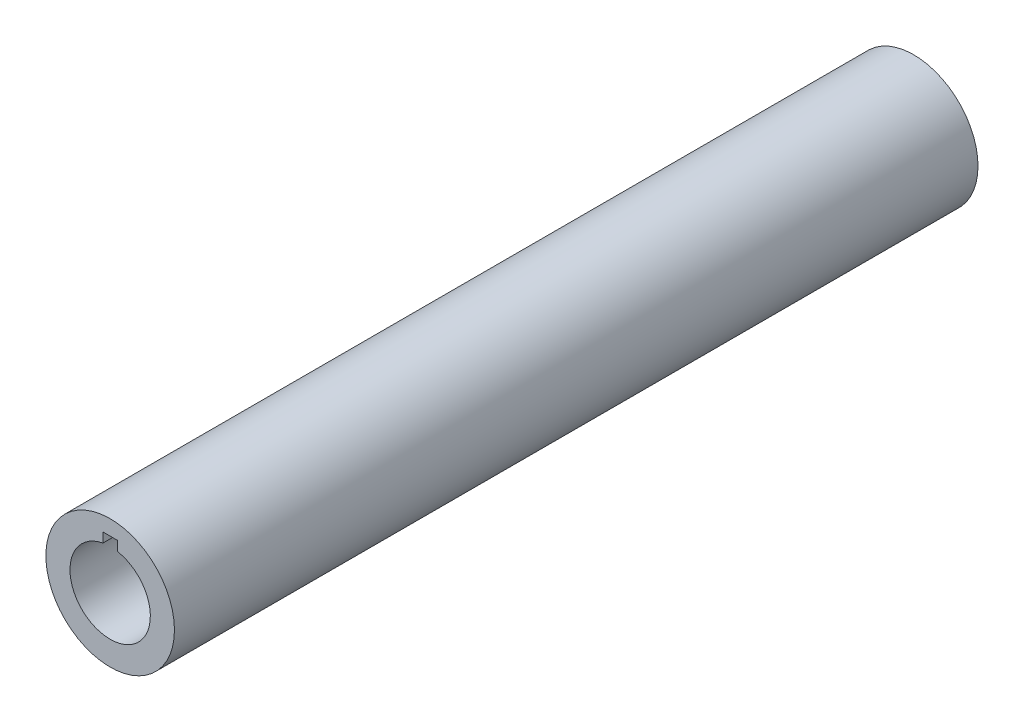
ISO-10303-21;
HEADER;
FILE_DESCRIPTION(('STEP AP214'),'2;1');
FILE_NAME('part.step','',(''),(''),'','','');
FILE_SCHEMA(('AUTOMOTIVE_DESIGN { 1 0 10303 214 1 1 1 1 }'));
ENDSEC;
DATA;
#1=APPLICATION_CONTEXT('core data for automotive mechanical design processes');
#2=APPLICATION_PROTOCOL_DEFINITION('international standard','automotive_design',2000,#1);
#3=PRODUCT_CONTEXT('',#1,'mechanical');
#4=PRODUCT('Part','Part','',(#3));
#5=PRODUCT_RELATED_PRODUCT_CATEGORY('part','',(#4));
#6=PRODUCT_DEFINITION_FORMATION('','',#4);
#7=PRODUCT_DEFINITION_CONTEXT('part definition',#1,'design');
#8=PRODUCT_DEFINITION('design','',#6,#7);
#9=PRODUCT_DEFINITION_SHAPE('','',#8);
#10=(LENGTH_UNIT() NAMED_UNIT(*) SI_UNIT(.MILLI.,.METRE.));
#11=(NAMED_UNIT(*) PLANE_ANGLE_UNIT() SI_UNIT($,.RADIAN.));
#12=(NAMED_UNIT(*) SI_UNIT($,.STERADIAN.) SOLID_ANGLE_UNIT());
#13=UNCERTAINTY_MEASURE_WITH_UNIT(LENGTH_MEASURE(1.E-05),#10,'distance_accuracy_value','');
#14=(GEOMETRIC_REPRESENTATION_CONTEXT(3) GLOBAL_UNCERTAINTY_ASSIGNED_CONTEXT((#13)) GLOBAL_UNIT_ASSIGNED_CONTEXT((#10,
#11,#12)) REPRESENTATION_CONTEXT('',''));
#15=CARTESIAN_POINT('',(0.,0.,0.));
#16=DIRECTION('',(0.,0.,1.));
#17=DIRECTION('',(1.,0.,0.));
#18=AXIS2_PLACEMENT_3D('',#15,#16,#17);
#19=CARTESIAN_POINT('',(0.,0.,50.));
#20=DIRECTION('',(0.,0.,1.));
#21=DIRECTION('',(1.,0.,0.));
#22=AXIS2_PLACEMENT_3D('',#19,#20,#21);
#23=PLANE('',#22);
#24=CARTESIAN_POINT('',(0.,0.,50.));
#25=DIRECTION('',(0.,0.,1.));
#26=DIRECTION('',(1.,0.,0.));
#27=AXIS2_PLACEMENT_3D('',#24,#25,#26);
#28=CIRCLE('',#27,4.);
#29=CARTESIAN_POINT('',(4.,0.,50.));
#30=VERTEX_POINT('',#29);
#31=EDGE_CURVE('E11',#30,#30,#28,.T.);
#32=ORIENTED_EDGE('',*,*,#31,.T.);
#33=EDGE_LOOP('',(#32));
#34=FACE_BOUND('',#33,.T.);
#35=DIRECTION('',(0.,1.,0.));
#36=VECTOR('',#35,1.);
#37=CARTESIAN_POINT('',(0.45,2.45916652547159,50.));
#38=LINE('',#37,#36);
#39=CARTESIAN_POINT('',(0.45,2.45916652547159,50.));
#40=VERTEX_POINT('',#39);
#41=CARTESIAN_POINT('',(0.45,3.05916652547159,50.));
#42=VERTEX_POINT('',#41);
#43=EDGE_CURVE('E90',#40,#42,#38,.T.);
#44=ORIENTED_EDGE('',*,*,#43,.F.);
#45=CARTESIAN_POINT('',(0.,0.,50.));
#46=DIRECTION('',(0.,0.,1.));
#47=DIRECTION('',(1.,0.,0.));
#48=AXIS2_PLACEMENT_3D('',#45,#46,#47);
#49=CIRCLE('',#48,2.5);
#50=CARTESIAN_POINT('',(-0.45,2.45916652547159,50.));
#51=VERTEX_POINT('',#50);
#52=EDGE_CURVE('E82',#51,#40,#49,.T.);
#53=ORIENTED_EDGE('',*,*,#52,.F.);
#54=DIRECTION('',(0.,-1.,0.));
#55=VECTOR('',#54,1.);
#56=CARTESIAN_POINT('',(-0.45,2.45916652547159,50.));
#57=LINE('',#56,#55);
#58=CARTESIAN_POINT('',(-0.45,3.05916652547159,50.));
#59=VERTEX_POINT('',#58);
#60=EDGE_CURVE('E103',#59,#51,#57,.T.);
#61=ORIENTED_EDGE('',*,*,#60,.F.);
#62=DIRECTION('',(-1.,0.,0.));
#63=VECTOR('',#62,1.);
#64=CARTESIAN_POINT('',(-0.45,3.05916652547159,50.));
#65=LINE('',#64,#63);
#66=EDGE_CURVE('E101',#42,#59,#65,.T.);
#67=ORIENTED_EDGE('',*,*,#66,.F.);
#68=EDGE_LOOP('',(#44,#53,#61,#67));
#69=FACE_BOUND('',#68,.T.);
#70=ADVANCED_FACE('F41',(#34,#69),#23,.T.);
#71=CARTESIAN_POINT('',(0.,0.,0.));
#72=DIRECTION('',(0.,0.,1.));
#73=DIRECTION('',(1.,0.,0.));
#74=AXIS2_PLACEMENT_3D('',#71,#72,#73);
#75=PLANE('',#74);
#76=CARTESIAN_POINT('',(0.,0.,0.));
#77=DIRECTION('',(0.,0.,1.));
#78=DIRECTION('',(1.,0.,0.));
#79=AXIS2_PLACEMENT_3D('',#76,#77,#78);
#80=CIRCLE('',#79,4.);
#81=CARTESIAN_POINT('',(4.,0.,0.));
#82=VERTEX_POINT('',#81);
#83=EDGE_CURVE('E45',#82,#82,#80,.T.);
#84=ORIENTED_EDGE('',*,*,#83,.F.);
#85=EDGE_LOOP('',(#84));
#86=FACE_BOUND('',#85,.T.);
#87=CARTESIAN_POINT('',(0.,0.,0.));
#88=DIRECTION('',(0.,0.,1.));
#89=DIRECTION('',(1.,0.,0.));
#90=AXIS2_PLACEMENT_3D('',#87,#88,#89);
#91=CIRCLE('',#90,2.5);
#92=CARTESIAN_POINT('',(-0.45,2.45916652547159,0.));
#93=VERTEX_POINT('',#92);
#94=CARTESIAN_POINT('',(0.45,2.45916652547159,0.));
#95=VERTEX_POINT('',#94);
#96=EDGE_CURVE('E64',#93,#95,#91,.T.);
#97=ORIENTED_EDGE('',*,*,#96,.T.);
#98=DIRECTION('',(0.,1.,0.));
#99=VECTOR('',#98,1.);
#100=CARTESIAN_POINT('',(0.45,2.45916652547159,0.));
#101=LINE('',#100,#99);
#102=CARTESIAN_POINT('',(0.45,3.05916652547159,0.));
#103=VERTEX_POINT('',#102);
#104=EDGE_CURVE('E97',#95,#103,#101,.T.);
#105=ORIENTED_EDGE('',*,*,#104,.T.);
#106=DIRECTION('',(-1.,0.,0.));
#107=VECTOR('',#106,1.);
#108=CARTESIAN_POINT('',(-0.45,3.05916652547159,0.));
#109=LINE('',#108,#107);
#110=CARTESIAN_POINT('',(-0.45,3.05916652547159,0.));
#111=VERTEX_POINT('',#110);
#112=EDGE_CURVE('E109',#103,#111,#109,.T.);
#113=ORIENTED_EDGE('',*,*,#112,.T.);
#114=DIRECTION('',(0.,-1.,0.));
#115=VECTOR('',#114,1.);
#116=CARTESIAN_POINT('',(-0.45,2.45916652547159,0.));
#117=LINE('',#116,#115);
#118=EDGE_CURVE('E91',#111,#93,#117,.T.);
#119=ORIENTED_EDGE('',*,*,#118,.T.);
#120=EDGE_LOOP('',(#97,#105,#113,#119));
#121=FACE_BOUND('',#120,.T.);
#122=ADVANCED_FACE('F120',(#86,#121),#75,.F.);
#123=CARTESIAN_POINT('',(0.,0.,50.));
#124=DIRECTION('',(0.,0.,-1.));
#125=DIRECTION('',(-1.,0.,0.));
#126=AXIS2_PLACEMENT_3D('',#123,#124,#125);
#127=CYLINDRICAL_SURFACE('',#126,4.);
#128=ORIENTED_EDGE('',*,*,#31,.F.);
#129=EDGE_LOOP('',(#128));
#130=FACE_BOUND('',#129,.T.);
#131=ORIENTED_EDGE('',*,*,#83,.T.);
#132=EDGE_LOOP('',(#131));
#133=FACE_BOUND('',#132,.T.);
#134=ADVANCED_FACE('F43',(#130,#133),#127,.T.);
#135=CARTESIAN_POINT('',(0.,0.,50.));
#136=DIRECTION('',(0.,0.,-1.));
#137=DIRECTION('',(-1.,0.,0.));
#138=AXIS2_PLACEMENT_3D('',#135,#136,#137);
#139=CYLINDRICAL_SURFACE('',#138,2.5);
#140=ORIENTED_EDGE('',*,*,#96,.F.);
#141=DIRECTION('',(0.,0.,-1.));
#142=VECTOR('',#141,1.);
#143=CARTESIAN_POINT('',(-0.45,2.45916652547159,50.));
#144=LINE('',#143,#142);
#145=EDGE_CURVE('E86',#51,#93,#144,.T.);
#146=ORIENTED_EDGE('',*,*,#145,.F.);
#147=ORIENTED_EDGE('',*,*,#52,.T.);
#148=DIRECTION('',(0.,0.,-1.));
#149=VECTOR('',#148,1.);
#150=CARTESIAN_POINT('',(0.45,2.45916652547159,50.));
#151=LINE('',#150,#149);
#152=EDGE_CURVE('E85',#40,#95,#151,.T.);
#153=ORIENTED_EDGE('',*,*,#152,.T.);
#154=EDGE_LOOP('',(#140,#146,#147,#153));
#155=FACE_BOUND('',#154,.T.);
#156=ADVANCED_FACE('F84',(#155),#139,.F.);
#157=CARTESIAN_POINT('',(0.45,2.45916652547159,50.));
#158=DIRECTION('',(-1.,0.,0.));
#159=DIRECTION('',(0.,0.,1.));
#160=AXIS2_PLACEMENT_3D('',#157,#158,#159);
#161=PLANE('',#160);
#162=ORIENTED_EDGE('',*,*,#104,.F.);
#163=ORIENTED_EDGE('',*,*,#152,.F.);
#164=ORIENTED_EDGE('',*,*,#43,.T.);
#165=DIRECTION('',(0.,0.,-1.));
#166=VECTOR('',#165,1.);
#167=CARTESIAN_POINT('',(0.45,3.05916652547159,50.));
#168=LINE('',#167,#166);
#169=EDGE_CURVE('E98',#42,#103,#168,.T.);
#170=ORIENTED_EDGE('',*,*,#169,.T.);
#171=EDGE_LOOP('',(#162,#163,#164,#170));
#172=FACE_BOUND('',#171,.T.);
#173=ADVANCED_FACE('F94',(#172),#161,.T.);
#174=CARTESIAN_POINT('',(-0.45,3.05916652547159,50.));
#175=DIRECTION('',(0.,-1.,0.));
#176=DIRECTION('',(0.,0.,-1.));
#177=AXIS2_PLACEMENT_3D('',#174,#175,#176);
#178=PLANE('',#177);
#179=ORIENTED_EDGE('',*,*,#112,.F.);
#180=ORIENTED_EDGE('',*,*,#169,.F.);
#181=ORIENTED_EDGE('',*,*,#66,.T.);
#182=DIRECTION('',(0.,0.,-1.));
#183=VECTOR('',#182,1.);
#184=CARTESIAN_POINT('',(-0.45,3.05916652547159,50.));
#185=LINE('',#184,#183);
#186=EDGE_CURVE('E56',#59,#111,#185,.T.);
#187=ORIENTED_EDGE('',*,*,#186,.T.);
#188=EDGE_LOOP('',(#179,#180,#181,#187));
#189=FACE_BOUND('',#188,.T.);
#190=ADVANCED_FACE('F118',(#189),#178,.T.);
#191=CARTESIAN_POINT('',(-0.45,2.45916652547159,50.));
#192=DIRECTION('',(1.,0.,0.));
#193=DIRECTION('',(0.,0.,-1.));
#194=AXIS2_PLACEMENT_3D('',#191,#192,#193);
#195=PLANE('',#194);
#196=ORIENTED_EDGE('',*,*,#118,.F.);
#197=ORIENTED_EDGE('',*,*,#186,.F.);
#198=ORIENTED_EDGE('',*,*,#60,.T.);
#199=ORIENTED_EDGE('',*,*,#145,.T.);
#200=EDGE_LOOP('',(#196,#197,#198,#199));
#201=FACE_BOUND('',#200,.T.);
#202=ADVANCED_FACE('F121',(#201),#195,.T.);
#203=CLOSED_SHELL('',(#70,#122,#134,#156,#173,#190,#202));
#204=MANIFOLD_SOLID_BREP('B2',#203);
#205=ADVANCED_BREP_SHAPE_REPRESENTATION('',(#18,#204),#14);
#206=SHAPE_DEFINITION_REPRESENTATION(#9,#205);
ENDSEC;
END-ISO-10303-21;
